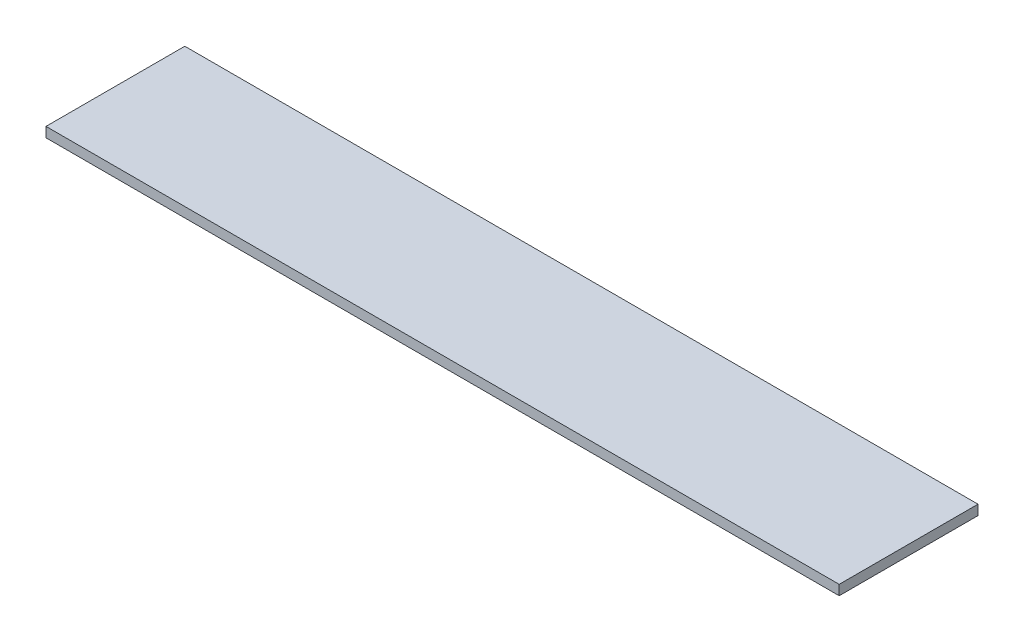
ISO-10303-21;
HEADER;
FILE_DESCRIPTION(('STEP AP214'),'2;1');
FILE_NAME('part.step','',(''),(''),'','','');
FILE_SCHEMA(('AUTOMOTIVE_DESIGN { 1 0 10303 214 1 1 1 1 }'));
ENDSEC;
DATA;
#1=APPLICATION_CONTEXT('core data for automotive mechanical design processes');
#2=APPLICATION_PROTOCOL_DEFINITION('international standard','automotive_design',2000,#1);
#3=PRODUCT_CONTEXT('',#1,'mechanical');
#4=PRODUCT('Part','Part','',(#3));
#5=PRODUCT_RELATED_PRODUCT_CATEGORY('part','',(#4));
#6=PRODUCT_DEFINITION_FORMATION('','',#4);
#7=PRODUCT_DEFINITION_CONTEXT('part definition',#1,'design');
#8=PRODUCT_DEFINITION('design','',#6,#7);
#9=PRODUCT_DEFINITION_SHAPE('','',#8);
#10=(LENGTH_UNIT() NAMED_UNIT(*) SI_UNIT(.MILLI.,.METRE.));
#11=(NAMED_UNIT(*) PLANE_ANGLE_UNIT() SI_UNIT($,.RADIAN.));
#12=(NAMED_UNIT(*) SI_UNIT($,.STERADIAN.) SOLID_ANGLE_UNIT());
#13=UNCERTAINTY_MEASURE_WITH_UNIT(LENGTH_MEASURE(1.E-05),#10,'distance_accuracy_value','');
#14=(GEOMETRIC_REPRESENTATION_CONTEXT(3) GLOBAL_UNCERTAINTY_ASSIGNED_CONTEXT((#13)) GLOBAL_UNIT_ASSIGNED_CONTEXT((#10,
#11,#12)) REPRESENTATION_CONTEXT('',''));
#15=CARTESIAN_POINT('',(0.,0.,0.));
#16=DIRECTION('',(0.,0.,1.));
#17=DIRECTION('',(1.,0.,0.));
#18=AXIS2_PLACEMENT_3D('',#15,#16,#17);
#19=CARTESIAN_POINT('',(127.,3.175,22.225));
#20=DIRECTION('',(-1.,0.,0.));
#21=DIRECTION('',(0.,0.,1.));
#22=AXIS2_PLACEMENT_3D('',#19,#20,#21);
#23=PLANE('',#22);
#24=DIRECTION('',(0.,0.,-1.));
#25=VECTOR('',#24,1.);
#26=CARTESIAN_POINT('',(127.,0.,22.225));
#27=LINE('',#26,#25);
#28=CARTESIAN_POINT('',(127.,0.,22.225));
#29=VERTEX_POINT('',#28);
#30=CARTESIAN_POINT('',(127.,0.,-22.225));
#31=VERTEX_POINT('',#30);
#32=EDGE_CURVE('E118',#29,#31,#27,.T.);
#33=ORIENTED_EDGE('',*,*,#32,.T.);
#34=DIRECTION('',(0.,-1.,0.));
#35=VECTOR('',#34,1.);
#36=CARTESIAN_POINT('',(127.,3.175,-22.225));
#37=LINE('',#36,#35);
#38=CARTESIAN_POINT('',(127.,3.175,-22.225));
#39=VERTEX_POINT('',#38);
#40=EDGE_CURVE('E12',#39,#31,#37,.T.);
#41=ORIENTED_EDGE('',*,*,#40,.F.);
#42=DIRECTION('',(0.,0.,-1.));
#43=VECTOR('',#42,1.);
#44=CARTESIAN_POINT('',(127.,3.175,22.225));
#45=LINE('',#44,#43);
#46=CARTESIAN_POINT('',(127.,3.175,22.225));
#47=VERTEX_POINT('',#46);
#48=EDGE_CURVE('E87',#47,#39,#45,.T.);
#49=ORIENTED_EDGE('',*,*,#48,.F.);
#50=DIRECTION('',(0.,-1.,0.));
#51=VECTOR('',#50,1.);
#52=CARTESIAN_POINT('',(127.,3.175,22.225));
#53=LINE('',#52,#51);
#54=EDGE_CURVE('E98',#47,#29,#53,.T.);
#55=ORIENTED_EDGE('',*,*,#54,.T.);
#56=EDGE_LOOP('',(#33,#41,#49,#55));
#57=FACE_BOUND('',#56,.T.);
#58=ADVANCED_FACE('F36',(#57),#23,.F.);
#59=CARTESIAN_POINT('',(-127.,3.175,-22.225));
#60=DIRECTION('',(0.,0.,1.));
#61=DIRECTION('',(1.,0.,0.));
#62=AXIS2_PLACEMENT_3D('',#59,#60,#61);
#63=PLANE('',#62);
#64=DIRECTION('',(-1.,0.,0.));
#65=VECTOR('',#64,1.);
#66=CARTESIAN_POINT('',(-127.,0.,-22.225));
#67=LINE('',#66,#65);
#68=CARTESIAN_POINT('',(-127.,0.,-22.225));
#69=VERTEX_POINT('',#68);
#70=EDGE_CURVE('E92',#31,#69,#67,.T.);
#71=ORIENTED_EDGE('',*,*,#70,.T.);
#72=DIRECTION('',(0.,-1.,0.));
#73=VECTOR('',#72,1.);
#74=CARTESIAN_POINT('',(-127.,3.175,-22.225));
#75=LINE('',#74,#73);
#76=CARTESIAN_POINT('',(-127.,3.175,-22.225));
#77=VERTEX_POINT('',#76);
#78=EDGE_CURVE('E44',#77,#69,#75,.T.);
#79=ORIENTED_EDGE('',*,*,#78,.F.);
#80=DIRECTION('',(-1.,0.,0.));
#81=VECTOR('',#80,1.);
#82=CARTESIAN_POINT('',(-127.,3.175,-22.225));
#83=LINE('',#82,#81);
#84=EDGE_CURVE('E82',#39,#77,#83,.T.);
#85=ORIENTED_EDGE('',*,*,#84,.F.);
#86=ORIENTED_EDGE('',*,*,#40,.T.);
#87=EDGE_LOOP('',(#71,#79,#85,#86));
#88=FACE_BOUND('',#87,.T.);
#89=ADVANCED_FACE('F91',(#88),#63,.F.);
#90=CARTESIAN_POINT('',(-127.,3.175,22.225));
#91=DIRECTION('',(1.,0.,0.));
#92=DIRECTION('',(0.,0.,-1.));
#93=AXIS2_PLACEMENT_3D('',#90,#91,#92);
#94=PLANE('',#93);
#95=DIRECTION('',(0.,0.,1.));
#96=VECTOR('',#95,1.);
#97=CARTESIAN_POINT('',(-127.,0.,22.225));
#98=LINE('',#97,#96);
#99=CARTESIAN_POINT('',(-127.,0.,22.225));
#100=VERTEX_POINT('',#99);
#101=EDGE_CURVE('E69',#69,#100,#98,.T.);
#102=ORIENTED_EDGE('',*,*,#101,.T.);
#103=DIRECTION('',(0.,-1.,0.));
#104=VECTOR('',#103,1.);
#105=CARTESIAN_POINT('',(-127.,3.175,22.225));
#106=LINE('',#105,#104);
#107=CARTESIAN_POINT('',(-127.,3.175,22.225));
#108=VERTEX_POINT('',#107);
#109=EDGE_CURVE('E93',#108,#100,#106,.T.);
#110=ORIENTED_EDGE('',*,*,#109,.F.);
#111=DIRECTION('',(0.,0.,1.));
#112=VECTOR('',#111,1.);
#113=CARTESIAN_POINT('',(-127.,3.175,22.225));
#114=LINE('',#113,#112);
#115=EDGE_CURVE('E85',#77,#108,#114,.T.);
#116=ORIENTED_EDGE('',*,*,#115,.F.);
#117=ORIENTED_EDGE('',*,*,#78,.T.);
#118=EDGE_LOOP('',(#102,#110,#116,#117));
#119=FACE_BOUND('',#118,.T.);
#120=ADVANCED_FACE('F94',(#119),#94,.F.);
#121=CARTESIAN_POINT('',(-127.,3.175,22.225));
#122=DIRECTION('',(0.,0.,-1.));
#123=DIRECTION('',(-1.,0.,0.));
#124=AXIS2_PLACEMENT_3D('',#121,#122,#123);
#125=PLANE('',#124);
#126=DIRECTION('',(1.,0.,0.));
#127=VECTOR('',#126,1.);
#128=CARTESIAN_POINT('',(-127.,0.,22.225));
#129=LINE('',#128,#127);
#130=EDGE_CURVE('E75',#100,#29,#129,.T.);
#131=ORIENTED_EDGE('',*,*,#130,.T.);
#132=ORIENTED_EDGE('',*,*,#54,.F.);
#133=DIRECTION('',(1.,0.,0.));
#134=VECTOR('',#133,1.);
#135=CARTESIAN_POINT('',(-127.,3.175,22.225));
#136=LINE('',#135,#134);
#137=EDGE_CURVE('E52',#108,#47,#136,.T.);
#138=ORIENTED_EDGE('',*,*,#137,.F.);
#139=ORIENTED_EDGE('',*,*,#109,.T.);
#140=EDGE_LOOP('',(#131,#132,#138,#139));
#141=FACE_BOUND('',#140,.T.);
#142=ADVANCED_FACE('F113',(#141),#125,.F.);
#143=CARTESIAN_POINT('',(0.,3.175,0.));
#144=DIRECTION('',(0.,-1.,0.));
#145=DIRECTION('',(0.,0.,-1.));
#146=AXIS2_PLACEMENT_3D('',#143,#144,#145);
#147=PLANE('',#146);
#148=ORIENTED_EDGE('',*,*,#48,.T.);
#149=ORIENTED_EDGE('',*,*,#84,.T.);
#150=ORIENTED_EDGE('',*,*,#115,.T.);
#151=ORIENTED_EDGE('',*,*,#137,.T.);
#152=EDGE_LOOP('',(#148,#149,#150,#151));
#153=FACE_BOUND('',#152,.T.);
#154=ADVANCED_FACE('F83',(#153),#147,.F.);
#155=CARTESIAN_POINT('',(0.,0.,0.));
#156=DIRECTION('',(0.,-1.,0.));
#157=DIRECTION('',(0.,0.,-1.));
#158=AXIS2_PLACEMENT_3D('',#155,#156,#157);
#159=PLANE('',#158);
#160=ORIENTED_EDGE('',*,*,#32,.F.);
#161=ORIENTED_EDGE('',*,*,#130,.F.);
#162=ORIENTED_EDGE('',*,*,#101,.F.);
#163=ORIENTED_EDGE('',*,*,#70,.F.);
#164=EDGE_LOOP('',(#160,#161,#162,#163));
#165=FACE_BOUND('',#164,.T.);
#166=ADVANCED_FACE('F116',(#165),#159,.T.);
#167=CLOSED_SHELL('',(#58,#89,#120,#142,#154,#166));
#168=MANIFOLD_SOLID_BREP('B2',#167);
#169=ADVANCED_BREP_SHAPE_REPRESENTATION('',(#18,#168),#14);
#170=SHAPE_DEFINITION_REPRESENTATION(#9,#169);
ENDSEC;
END-ISO-10303-21;
